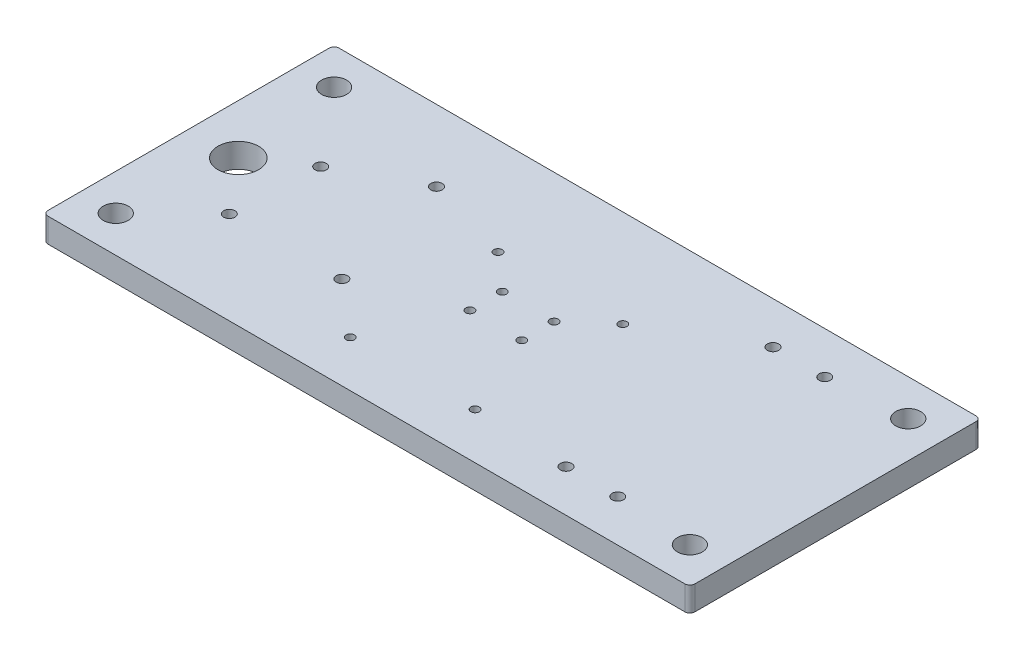
ISO-10303-21;
HEADER;
FILE_DESCRIPTION(('STEP AP214'),'2;1');
FILE_NAME('part.step','',(''),(''),'','','');
FILE_SCHEMA(('AUTOMOTIVE_DESIGN { 1 0 10303 214 1 1 1 1 }'));
ENDSEC;
DATA;
#1=APPLICATION_CONTEXT('core data for automotive mechanical design processes');
#2=APPLICATION_PROTOCOL_DEFINITION('international standard','automotive_design',2000,#1);
#3=PRODUCT_CONTEXT('',#1,'mechanical');
#4=PRODUCT('Part','Part','',(#3));
#5=PRODUCT_RELATED_PRODUCT_CATEGORY('part','',(#4));
#6=PRODUCT_DEFINITION_FORMATION('','',#4);
#7=PRODUCT_DEFINITION_CONTEXT('part definition',#1,'design');
#8=PRODUCT_DEFINITION('design','',#6,#7);
#9=PRODUCT_DEFINITION_SHAPE('','',#8);
#10=(LENGTH_UNIT() NAMED_UNIT(*) SI_UNIT(.MILLI.,.METRE.));
#11=(NAMED_UNIT(*) PLANE_ANGLE_UNIT() SI_UNIT($,.RADIAN.));
#12=(NAMED_UNIT(*) SI_UNIT($,.STERADIAN.) SOLID_ANGLE_UNIT());
#13=UNCERTAINTY_MEASURE_WITH_UNIT(LENGTH_MEASURE(1.E-05),#10,'distance_accuracy_value','');
#14=(GEOMETRIC_REPRESENTATION_CONTEXT(3) GLOBAL_UNCERTAINTY_ASSIGNED_CONTEXT((#13)) GLOBAL_UNIT_ASSIGNED_CONTEXT((#10,
#11,#12)) REPRESENTATION_CONTEXT('',''));
#15=CARTESIAN_POINT('',(0.,0.,0.));
#16=DIRECTION('',(0.,0.,1.));
#17=DIRECTION('',(1.,0.,0.));
#18=AXIS2_PLACEMENT_3D('',#15,#16,#17);
#19=CARTESIAN_POINT('',(127.,9.525,57.15));
#20=DIRECTION('',(-1.,0.,0.));
#21=DIRECTION('',(0.,0.,1.));
#22=AXIS2_PLACEMENT_3D('',#19,#20,#21);
#23=PLANE('',#22);
#24=DIRECTION('',(0.,0.,-1.));
#25=VECTOR('',#24,1.);
#26=CARTESIAN_POINT('',(127.,0.,57.15));
#27=LINE('',#26,#25);
#28=CARTESIAN_POINT('',(127.,0.,55.15));
#29=VERTEX_POINT('',#28);
#30=CARTESIAN_POINT('',(127.,0.,-55.15));
#31=VERTEX_POINT('',#30);
#32=EDGE_CURVE('E139',#29,#31,#27,.T.);
#33=ORIENTED_EDGE('',*,*,#32,.T.);
#34=DIRECTION('',(0.,-1.,0.));
#35=VECTOR('',#34,1.);
#36=CARTESIAN_POINT('',(127.,9.525,-55.15));
#37=LINE('',#36,#35);
#38=CARTESIAN_POINT('',(127.,9.525,-55.15));
#39=VERTEX_POINT('',#38);
#40=EDGE_CURVE('E173',#31,#39,#37,.F.);
#41=ORIENTED_EDGE('',*,*,#40,.T.);
#42=DIRECTION('',(0.,0.,-1.));
#43=VECTOR('',#42,1.);
#44=CARTESIAN_POINT('',(127.,9.525,57.15));
#45=LINE('',#44,#43);
#46=CARTESIAN_POINT('',(127.,9.525,55.15));
#47=VERTEX_POINT('',#46);
#48=EDGE_CURVE('E137',#47,#39,#45,.T.);
#49=ORIENTED_EDGE('',*,*,#48,.F.);
#50=DIRECTION('',(0.,-1.,0.));
#51=VECTOR('',#50,1.);
#52=CARTESIAN_POINT('',(127.,9.525,55.15));
#53=LINE('',#52,#51);
#54=EDGE_CURVE('E167',#47,#29,#53,.T.);
#55=ORIENTED_EDGE('',*,*,#54,.T.);
#56=EDGE_LOOP('',(#33,#41,#49,#55));
#57=FACE_BOUND('',#56,.T.);
#58=ADVANCED_FACE('F41',(#57),#23,.F.);
#59=CARTESIAN_POINT('',(-127.,9.525,-57.15));
#60=DIRECTION('',(0.,0.,1.));
#61=DIRECTION('',(1.,0.,0.));
#62=AXIS2_PLACEMENT_3D('',#59,#60,#61);
#63=PLANE('',#62);
#64=DIRECTION('',(-1.,0.,0.));
#65=VECTOR('',#64,1.);
#66=CARTESIAN_POINT('',(-127.,0.,-57.15));
#67=LINE('',#66,#65);
#68=CARTESIAN_POINT('',(125.,0.,-57.15));
#69=VERTEX_POINT('',#68);
#70=CARTESIAN_POINT('',(-125.,0.,-57.15));
#71=VERTEX_POINT('',#70);
#72=EDGE_CURVE('E131',#69,#71,#67,.T.);
#73=ORIENTED_EDGE('',*,*,#72,.T.);
#74=DIRECTION('',(0.,-1.,0.));
#75=VECTOR('',#74,1.);
#76=CARTESIAN_POINT('',(-125.,9.525,-57.15));
#77=LINE('',#76,#75);
#78=CARTESIAN_POINT('',(-125.,9.525,-57.15));
#79=VERTEX_POINT('',#78);
#80=EDGE_CURVE('E111',#71,#79,#77,.F.);
#81=ORIENTED_EDGE('',*,*,#80,.T.);
#82=DIRECTION('',(-1.,0.,0.));
#83=VECTOR('',#82,1.);
#84=CARTESIAN_POINT('',(-127.,9.525,-57.15));
#85=LINE('',#84,#83);
#86=CARTESIAN_POINT('',(125.,9.525,-57.15));
#87=VERTEX_POINT('',#86);
#88=EDGE_CURVE('E292',#87,#79,#85,.T.);
#89=ORIENTED_EDGE('',*,*,#88,.F.);
#90=DIRECTION('',(0.,-1.,0.));
#91=VECTOR('',#90,1.);
#92=CARTESIAN_POINT('',(125.,9.525,-57.15));
#93=LINE('',#92,#91);
#94=EDGE_CURVE('E118',#87,#69,#93,.T.);
#95=ORIENTED_EDGE('',*,*,#94,.T.);
#96=EDGE_LOOP('',(#73,#81,#89,#95));
#97=FACE_BOUND('',#96,.T.);
#98=ADVANCED_FACE('F308',(#97),#63,.F.);
#99=CARTESIAN_POINT('',(-127.,9.525,57.15));
#100=DIRECTION('',(1.,0.,0.));
#101=DIRECTION('',(0.,0.,-1.));
#102=AXIS2_PLACEMENT_3D('',#99,#100,#101);
#103=PLANE('',#102);
#104=DIRECTION('',(0.,0.,1.));
#105=VECTOR('',#104,1.);
#106=CARTESIAN_POINT('',(-127.,9.525,57.15));
#107=LINE('',#106,#105);
#108=CARTESIAN_POINT('',(-127.,9.525,-55.15));
#109=VERTEX_POINT('',#108);
#110=CARTESIAN_POINT('',(-127.,9.525,55.15));
#111=VERTEX_POINT('',#110);
#112=EDGE_CURVE('E130',#109,#111,#107,.T.);
#113=ORIENTED_EDGE('',*,*,#112,.F.);
#114=DIRECTION('',(0.,-1.,0.));
#115=VECTOR('',#114,1.);
#116=CARTESIAN_POINT('',(-127.,9.525,-55.15));
#117=LINE('',#116,#115);
#118=CARTESIAN_POINT('',(-127.,0.,-55.15));
#119=VERTEX_POINT('',#118);
#120=EDGE_CURVE('E115',#109,#119,#117,.T.);
#121=ORIENTED_EDGE('',*,*,#120,.T.);
#122=DIRECTION('',(0.,0.,1.));
#123=VECTOR('',#122,1.);
#124=CARTESIAN_POINT('',(-127.,0.,57.15));
#125=LINE('',#124,#123);
#126=CARTESIAN_POINT('',(-127.,0.,55.15));
#127=VERTEX_POINT('',#126);
#128=EDGE_CURVE('E124',#119,#127,#125,.T.);
#129=ORIENTED_EDGE('',*,*,#128,.T.);
#130=DIRECTION('',(0.,-1.,0.));
#131=VECTOR('',#130,1.);
#132=CARTESIAN_POINT('',(-127.,9.525,55.15));
#133=LINE('',#132,#131);
#134=EDGE_CURVE('E128',#127,#111,#133,.F.);
#135=ORIENTED_EDGE('',*,*,#134,.T.);
#136=EDGE_LOOP('',(#113,#121,#129,#135));
#137=FACE_BOUND('',#136,.T.);
#138=ADVANCED_FACE('F122',(#137),#103,.F.);
#139=CARTESIAN_POINT('',(-127.,9.525,57.15));
#140=DIRECTION('',(0.,0.,-1.));
#141=DIRECTION('',(-1.,0.,0.));
#142=AXIS2_PLACEMENT_3D('',#139,#140,#141);
#143=PLANE('',#142);
#144=DIRECTION('',(1.,0.,0.));
#145=VECTOR('',#144,1.);
#146=CARTESIAN_POINT('',(-127.,0.,57.15));
#147=LINE('',#146,#145);
#148=CARTESIAN_POINT('',(-125.,0.,57.15));
#149=VERTEX_POINT('',#148);
#150=CARTESIAN_POINT('',(125.,0.,57.15));
#151=VERTEX_POINT('',#150);
#152=EDGE_CURVE('E134',#149,#151,#147,.T.);
#153=ORIENTED_EDGE('',*,*,#152,.T.);
#154=DIRECTION('',(0.,-1.,0.));
#155=VECTOR('',#154,1.);
#156=CARTESIAN_POINT('',(125.,9.525,57.15));
#157=LINE('',#156,#155);
#158=CARTESIAN_POINT('',(125.,9.525,57.15));
#159=VERTEX_POINT('',#158);
#160=EDGE_CURVE('E11',#151,#159,#157,.F.);
#161=ORIENTED_EDGE('',*,*,#160,.T.);
#162=DIRECTION('',(1.,0.,0.));
#163=VECTOR('',#162,1.);
#164=CARTESIAN_POINT('',(-127.,9.525,57.15));
#165=LINE('',#164,#163);
#166=CARTESIAN_POINT('',(-125.,9.525,57.15));
#167=VERTEX_POINT('',#166);
#168=EDGE_CURVE('E155',#167,#159,#165,.T.);
#169=ORIENTED_EDGE('',*,*,#168,.F.);
#170=DIRECTION('',(0.,-1.,0.));
#171=VECTOR('',#170,1.);
#172=CARTESIAN_POINT('',(-125.,9.525,57.15));
#173=LINE('',#172,#171);
#174=EDGE_CURVE('E49',#167,#149,#173,.T.);
#175=ORIENTED_EDGE('',*,*,#174,.T.);
#176=EDGE_LOOP('',(#153,#161,#169,#175));
#177=FACE_BOUND('',#176,.T.);
#178=ADVANCED_FACE('F320',(#177),#143,.F.);
#179=CARTESIAN_POINT('',(0.,9.525,0.));
#180=DIRECTION('',(0.,-1.,0.));
#181=DIRECTION('',(0.,0.,-1.));
#182=AXIS2_PLACEMENT_3D('',#179,#180,#181);
#183=PLANE('',#182);
#184=CARTESIAN_POINT('',(-10.16,9.525,6.35));
#185=DIRECTION('',(0.,1.,0.));
#186=DIRECTION('',(0.,0.,1.));
#187=AXIS2_PLACEMENT_3D('',#184,#185,#186);
#188=CIRCLE('',#187,1.65);
#189=CARTESIAN_POINT('',(-10.16,9.525,8.));
#190=VERTEX_POINT('',#189);
#191=EDGE_CURVE('E223',#190,#190,#188,.T.);
#192=ORIENTED_EDGE('',*,*,#191,.F.);
#193=EDGE_LOOP('',(#192));
#194=FACE_BOUND('',#193,.T.);
#195=CARTESIAN_POINT('',(10.16,9.525,6.35));
#196=DIRECTION('',(0.,1.,0.));
#197=DIRECTION('',(0.,0.,1.));
#198=AXIS2_PLACEMENT_3D('',#195,#196,#197);
#199=CIRCLE('',#198,1.65);
#200=CARTESIAN_POINT('',(10.16,9.525,8.));
#201=VERTEX_POINT('',#200);
#202=EDGE_CURVE('E212',#201,#201,#199,.T.);
#203=ORIENTED_EDGE('',*,*,#202,.F.);
#204=EDGE_LOOP('',(#203));
#205=FACE_BOUND('',#204,.T.);
#206=CARTESIAN_POINT('',(10.16,9.525,-6.35));
#207=DIRECTION('',(0.,1.,0.));
#208=DIRECTION('',(0.,0.,1.));
#209=AXIS2_PLACEMENT_3D('',#206,#207,#208);
#210=CIRCLE('',#209,1.65);
#211=CARTESIAN_POINT('',(10.16,9.525,-4.7));
#212=VERTEX_POINT('',#211);
#213=EDGE_CURVE('E209',#212,#212,#210,.T.);
#214=ORIENTED_EDGE('',*,*,#213,.F.);
#215=EDGE_LOOP('',(#214));
#216=FACE_BOUND('',#215,.T.);
#217=CARTESIAN_POINT('',(-10.16,9.525,-6.35));
#218=DIRECTION('',(0.,1.,0.));
#219=DIRECTION('',(0.,0.,1.));
#220=AXIS2_PLACEMENT_3D('',#217,#218,#219);
#221=CIRCLE('',#220,1.65);
#222=CARTESIAN_POINT('',(-10.16,9.525,-4.7));
#223=VERTEX_POINT('',#222);
#224=EDGE_CURVE('E204',#223,#223,#221,.T.);
#225=ORIENTED_EDGE('',*,*,#224,.F.);
#226=EDGE_LOOP('',(#225));
#227=FACE_BOUND('',#226,.T.);
#228=CARTESIAN_POINT('',(61.84,9.525,40.64));
#229=DIRECTION('',(0.,1.,0.));
#230=DIRECTION('',(0.,0.,1.));
#231=AXIS2_PLACEMENT_3D('',#228,#229,#230);
#232=CIRCLE('',#231,2.225);
#233=CARTESIAN_POINT('',(61.84,9.525,42.865));
#234=VERTEX_POINT('',#233);
#235=EDGE_CURVE('E201',#234,#234,#232,.T.);
#236=ORIENTED_EDGE('',*,*,#235,.F.);
#237=EDGE_LOOP('',(#236));
#238=FACE_BOUND('',#237,.T.);
#239=CARTESIAN_POINT('',(82.16,9.525,40.64));
#240=DIRECTION('',(0.,1.,0.));
#241=DIRECTION('',(0.,0.,1.));
#242=AXIS2_PLACEMENT_3D('',#239,#240,#241);
#243=CIRCLE('',#242,2.225);
#244=CARTESIAN_POINT('',(82.16,9.525,42.865));
#245=VERTEX_POINT('',#244);
#246=EDGE_CURVE('E200',#245,#245,#243,.T.);
#247=ORIENTED_EDGE('',*,*,#246,.F.);
#248=EDGE_LOOP('',(#247));
#249=FACE_BOUND('',#248,.T.);
#250=CARTESIAN_POINT('',(82.16,9.525,-40.64));
#251=DIRECTION('',(0.,1.,0.));
#252=DIRECTION('',(0.,0.,1.));
#253=AXIS2_PLACEMENT_3D('',#250,#251,#252);
#254=CIRCLE('',#253,2.225);
#255=CARTESIAN_POINT('',(82.16,9.525,-38.415));
#256=VERTEX_POINT('',#255);
#257=EDGE_CURVE('E193',#256,#256,#254,.T.);
#258=ORIENTED_EDGE('',*,*,#257,.F.);
#259=EDGE_LOOP('',(#258));
#260=FACE_BOUND('',#259,.T.);
#261=CARTESIAN_POINT('',(61.84,9.525,-40.64));
#262=DIRECTION('',(0.,1.,0.));
#263=DIRECTION('',(0.,0.,1.));
#264=AXIS2_PLACEMENT_3D('',#261,#262,#263);
#265=CIRCLE('',#264,2.225);
#266=CARTESIAN_POINT('',(61.84,9.525,-38.415));
#267=VERTEX_POINT('',#266);
#268=EDGE_CURVE('E189',#267,#267,#265,.T.);
#269=ORIENTED_EDGE('',*,*,#268,.F.);
#270=EDGE_LOOP('',(#269));
#271=FACE_BOUND('',#270,.T.);
#272=CARTESIAN_POINT('',(-107.475,9.525,0.));
#273=DIRECTION('',(0.,1.,0.));
#274=DIRECTION('',(0.,0.,1.));
#275=AXIS2_PLACEMENT_3D('',#272,#273,#274);
#276=CIRCLE('',#275,8.);
#277=CARTESIAN_POINT('',(-107.475,9.525,8.));
#278=VERTEX_POINT('',#277);
#279=EDGE_CURVE('E186',#278,#278,#276,.T.);
#280=ORIENTED_EDGE('',*,*,#279,.F.);
#281=EDGE_LOOP('',(#280));
#282=FACE_BOUND('',#281,.T.);
#283=CARTESIAN_POINT('',(-46.,9.525,20.8));
#284=DIRECTION('',(0.,1.,0.));
#285=DIRECTION('',(0.,0.,1.));
#286=AXIS2_PLACEMENT_3D('',#283,#284,#285);
#287=CIRCLE('',#286,2.225);
#288=CARTESIAN_POINT('',(-46.,9.525,23.025));
#289=VERTEX_POINT('',#288);
#290=EDGE_CURVE('E185',#289,#289,#287,.T.);
#291=ORIENTED_EDGE('',*,*,#290,.F.);
#292=EDGE_LOOP('',(#291));
#293=FACE_BOUND('',#292,.T.);
#294=CARTESIAN_POINT('',(-90.2,9.525,20.8));
#295=DIRECTION('',(0.,1.,0.));
#296=DIRECTION('',(0.,0.,1.));
#297=AXIS2_PLACEMENT_3D('',#294,#295,#296);
#298=CIRCLE('',#297,2.225);
#299=CARTESIAN_POINT('',(-90.2,9.525,23.025));
#300=VERTEX_POINT('',#299);
#301=EDGE_CURVE('E181',#300,#300,#298,.T.);
#302=ORIENTED_EDGE('',*,*,#301,.F.);
#303=EDGE_LOOP('',(#302));
#304=FACE_BOUND('',#303,.T.);
#305=CARTESIAN_POINT('',(-88.35,9.525,-13.25));
#306=DIRECTION('',(0.,1.,0.));
#307=DIRECTION('',(0.,0.,1.));
#308=AXIS2_PLACEMENT_3D('',#305,#306,#307);
#309=CIRCLE('',#308,2.225);
#310=CARTESIAN_POINT('',(-88.35,9.525,-11.025));
#311=VERTEX_POINT('',#310);
#312=EDGE_CURVE('E179',#311,#311,#309,.T.);
#313=ORIENTED_EDGE('',*,*,#312,.F.);
#314=EDGE_LOOP('',(#313));
#315=FACE_BOUND('',#314,.T.);
#316=CARTESIAN_POINT('',(-58.8,9.525,-29.15));
#317=DIRECTION('',(0.,1.,0.));
#318=DIRECTION('',(0.,0.,1.));
#319=AXIS2_PLACEMENT_3D('',#316,#317,#318);
#320=CIRCLE('',#319,2.225);
#321=CARTESIAN_POINT('',(-58.8,9.525,-26.925));
#322=VERTEX_POINT('',#321);
#323=EDGE_CURVE('E178',#322,#322,#320,.T.);
#324=ORIENTED_EDGE('',*,*,#323,.F.);
#325=EDGE_LOOP('',(#324));
#326=FACE_BOUND('',#325,.T.);
#327=CARTESIAN_POINT('',(-24.5,9.525,39.));
#328=DIRECTION('',(0.,1.,0.));
#329=DIRECTION('',(0.,0.,1.));
#330=AXIS2_PLACEMENT_3D('',#327,#328,#329);
#331=CIRCLE('',#330,1.65);
#332=CARTESIAN_POINT('',(-24.5,9.525,40.65));
#333=VERTEX_POINT('',#332);
#334=EDGE_CURVE('E253',#333,#333,#331,.T.);
#335=ORIENTED_EDGE('',*,*,#334,.F.);
#336=EDGE_LOOP('',(#335));
#337=FACE_BOUND('',#336,.T.);
#338=CARTESIAN_POINT('',(24.5,9.525,39.));
#339=DIRECTION('',(0.,1.,0.));
#340=DIRECTION('',(0.,0.,1.));
#341=AXIS2_PLACEMENT_3D('',#338,#339,#340);
#342=CIRCLE('',#341,1.65);
#343=CARTESIAN_POINT('',(24.5,9.525,40.65));
#344=VERTEX_POINT('',#343);
#345=EDGE_CURVE('E260',#344,#344,#342,.T.);
#346=ORIENTED_EDGE('',*,*,#345,.F.);
#347=EDGE_LOOP('',(#346));
#348=FACE_BOUND('',#347,.T.);
#349=CARTESIAN_POINT('',(-24.5,9.525,-19.));
#350=DIRECTION('',(0.,1.,0.));
#351=DIRECTION('',(0.,0.,1.));
#352=AXIS2_PLACEMENT_3D('',#349,#350,#351);
#353=CIRCLE('',#352,1.65);
#354=CARTESIAN_POINT('',(-24.5,9.525,-17.35));
#355=VERTEX_POINT('',#354);
#356=EDGE_CURVE('E152',#355,#355,#353,.T.);
#357=ORIENTED_EDGE('',*,*,#356,.F.);
#358=EDGE_LOOP('',(#357));
#359=FACE_BOUND('',#358,.T.);
#360=CARTESIAN_POINT('',(24.5,9.525,-19.));
#361=DIRECTION('',(0.,1.,0.));
#362=DIRECTION('',(0.,0.,1.));
#363=AXIS2_PLACEMENT_3D('',#360,#361,#362);
#364=CIRCLE('',#363,1.65);
#365=CARTESIAN_POINT('',(24.5,9.525,-17.35));
#366=VERTEX_POINT('',#365);
#367=EDGE_CURVE('E147',#366,#366,#364,.T.);
#368=ORIENTED_EDGE('',*,*,#367,.F.);
#369=EDGE_LOOP('',(#368));
#370=FACE_BOUND('',#369,.T.);
#371=CARTESIAN_POINT('',(112.7125,9.525,-42.8625000000012));
#372=DIRECTION('',(0.,1.,0.));
#373=DIRECTION('',(0.,0.,1.));
#374=AXIS2_PLACEMENT_3D('',#371,#372,#373);
#375=CIRCLE('',#374,4.9022);
#376=CARTESIAN_POINT('',(112.7125,9.525,-37.9603000000012));
#377=VERTEX_POINT('',#376);
#378=EDGE_CURVE('E275',#377,#377,#375,.T.);
#379=ORIENTED_EDGE('',*,*,#378,.F.);
#380=EDGE_LOOP('',(#379));
#381=FACE_BOUND('',#380,.T.);
#382=CARTESIAN_POINT('',(112.7125,9.525,42.8674999999988));
#383=DIRECTION('',(0.,1.,0.));
#384=DIRECTION('',(0.,0.,1.));
#385=AXIS2_PLACEMENT_3D('',#382,#383,#384);
#386=CIRCLE('',#385,4.9022);
#387=CARTESIAN_POINT('',(112.7125,9.525,47.7696999999988));
#388=VERTEX_POINT('',#387);
#389=EDGE_CURVE('E148',#388,#388,#386,.T.);
#390=ORIENTED_EDGE('',*,*,#389,.F.);
#391=EDGE_LOOP('',(#390));
#392=FACE_BOUND('',#391,.T.);
#393=CARTESIAN_POINT('',(-112.7175,9.525,-42.8625000000012));
#394=DIRECTION('',(0.,1.,0.));
#395=DIRECTION('',(0.,0.,1.));
#396=AXIS2_PLACEMENT_3D('',#393,#394,#395);
#397=CIRCLE('',#396,4.9022);
#398=CARTESIAN_POINT('',(-112.7175,9.525,-37.9603000000012));
#399=VERTEX_POINT('',#398);
#400=EDGE_CURVE('E144',#399,#399,#397,.T.);
#401=ORIENTED_EDGE('',*,*,#400,.F.);
#402=EDGE_LOOP('',(#401));
#403=FACE_BOUND('',#402,.T.);
#404=CARTESIAN_POINT('',(-112.7175,9.525,42.867499999999));
#405=DIRECTION('',(0.,1.,0.));
#406=DIRECTION('',(0.,0.,1.));
#407=AXIS2_PLACEMENT_3D('',#404,#405,#406);
#408=CIRCLE('',#407,4.9022);
#409=CARTESIAN_POINT('',(-112.7175,9.525,47.769699999999));
#410=VERTEX_POINT('',#409);
#411=EDGE_CURVE('E283',#410,#410,#408,.T.);
#412=ORIENTED_EDGE('',*,*,#411,.F.);
#413=EDGE_LOOP('',(#412));
#414=FACE_BOUND('',#413,.T.);
#415=ORIENTED_EDGE('',*,*,#88,.T.);
#416=CARTESIAN_POINT('',(-125.,9.525,-55.15));
#417=DIRECTION('',(0.,-1.,0.));
#418=DIRECTION('',(0.,0.,-1.));
#419=AXIS2_PLACEMENT_3D('',#416,#417,#418);
#420=CIRCLE('',#419,2.);
#421=EDGE_CURVE('E166',#79,#109,#420,.F.);
#422=ORIENTED_EDGE('',*,*,#421,.T.);
#423=ORIENTED_EDGE('',*,*,#112,.T.);
#424=CARTESIAN_POINT('',(-125.,9.525,55.15));
#425=DIRECTION('',(0.,-1.,0.));
#426=DIRECTION('',(0.,0.,-1.));
#427=AXIS2_PLACEMENT_3D('',#424,#425,#426);
#428=CIRCLE('',#427,2.);
#429=EDGE_CURVE('E64',#111,#167,#428,.F.);
#430=ORIENTED_EDGE('',*,*,#429,.T.);
#431=ORIENTED_EDGE('',*,*,#168,.T.);
#432=CARTESIAN_POINT('',(125.,9.525,55.15));
#433=DIRECTION('',(0.,-1.,0.));
#434=DIRECTION('',(0.,0.,-1.));
#435=AXIS2_PLACEMENT_3D('',#432,#433,#434);
#436=CIRCLE('',#435,2.);
#437=EDGE_CURVE('E165',#159,#47,#436,.F.);
#438=ORIENTED_EDGE('',*,*,#437,.T.);
#439=ORIENTED_EDGE('',*,*,#48,.T.);
#440=CARTESIAN_POINT('',(125.,9.525,-55.15));
#441=DIRECTION('',(0.,-1.,0.));
#442=DIRECTION('',(0.,0.,-1.));
#443=AXIS2_PLACEMENT_3D('',#440,#441,#442);
#444=CIRCLE('',#443,2.);
#445=EDGE_CURVE('E161',#39,#87,#444,.F.);
#446=ORIENTED_EDGE('',*,*,#445,.T.);
#447=EDGE_LOOP('',(#415,#422,#423,#430,#431,#438,#439,#446));
#448=FACE_BOUND('',#447,.T.);
#449=ADVANCED_FACE('F306',(#194,#205,#216,#227,#238,#249,#260,#271,#282,#293,#304,#315,#326,
#337,#348,#359,#370,#381,#392,#403,#414,#448),#183,.F.);
#450=CARTESIAN_POINT('',(0.,0.,0.));
#451=DIRECTION('',(0.,-1.,0.));
#452=DIRECTION('',(0.,0.,-1.));
#453=AXIS2_PLACEMENT_3D('',#450,#451,#452);
#454=PLANE('',#453);
#455=CARTESIAN_POINT('',(-10.16,0.,6.35));
#456=DIRECTION('',(0.,-1.,0.));
#457=DIRECTION('',(0.,0.,-1.));
#458=AXIS2_PLACEMENT_3D('',#455,#456,#457);
#459=CIRCLE('',#458,1.65);
#460=CARTESIAN_POINT('',(-10.16,0.,4.7));
#461=VERTEX_POINT('',#460);
#462=EDGE_CURVE('E44',#461,#461,#459,.T.);
#463=ORIENTED_EDGE('',*,*,#462,.F.);
#464=EDGE_LOOP('',(#463));
#465=FACE_BOUND('',#464,.T.);
#466=CARTESIAN_POINT('',(10.16,0.,6.35));
#467=DIRECTION('',(0.,-1.,0.));
#468=DIRECTION('',(0.,0.,-1.));
#469=AXIS2_PLACEMENT_3D('',#466,#467,#468);
#470=CIRCLE('',#469,1.65);
#471=CARTESIAN_POINT('',(10.16,0.,4.7));
#472=VERTEX_POINT('',#471);
#473=EDGE_CURVE('E206',#472,#472,#470,.T.);
#474=ORIENTED_EDGE('',*,*,#473,.F.);
#475=EDGE_LOOP('',(#474));
#476=FACE_BOUND('',#475,.T.);
#477=CARTESIAN_POINT('',(10.16,0.,-6.35));
#478=DIRECTION('',(0.,-1.,0.));
#479=DIRECTION('',(0.,0.,-1.));
#480=AXIS2_PLACEMENT_3D('',#477,#478,#479);
#481=CIRCLE('',#480,1.65);
#482=CARTESIAN_POINT('',(10.16,0.,-8.));
#483=VERTEX_POINT('',#482);
#484=EDGE_CURVE('E207',#483,#483,#481,.T.);
#485=ORIENTED_EDGE('',*,*,#484,.F.);
#486=EDGE_LOOP('',(#485));
#487=FACE_BOUND('',#486,.T.);
#488=CARTESIAN_POINT('',(-10.16,0.,-6.35));
#489=DIRECTION('',(0.,-1.,0.));
#490=DIRECTION('',(0.,0.,-1.));
#491=AXIS2_PLACEMENT_3D('',#488,#489,#490);
#492=CIRCLE('',#491,1.65);
#493=CARTESIAN_POINT('',(-10.16,0.,-8.));
#494=VERTEX_POINT('',#493);
#495=EDGE_CURVE('E205',#494,#494,#492,.T.);
#496=ORIENTED_EDGE('',*,*,#495,.F.);
#497=EDGE_LOOP('',(#496));
#498=FACE_BOUND('',#497,.T.);
#499=CARTESIAN_POINT('',(61.84,0.,40.64));
#500=DIRECTION('',(0.,-1.,0.));
#501=DIRECTION('',(0.,0.,-1.));
#502=AXIS2_PLACEMENT_3D('',#499,#500,#501);
#503=CIRCLE('',#502,2.225);
#504=CARTESIAN_POINT('',(61.84,0.,38.415));
#505=VERTEX_POINT('',#504);
#506=EDGE_CURVE('E198',#505,#505,#503,.T.);
#507=ORIENTED_EDGE('',*,*,#506,.F.);
#508=EDGE_LOOP('',(#507));
#509=FACE_BOUND('',#508,.T.);
#510=CARTESIAN_POINT('',(82.16,0.,40.64));
#511=DIRECTION('',(0.,-1.,0.));
#512=DIRECTION('',(0.,0.,-1.));
#513=AXIS2_PLACEMENT_3D('',#510,#511,#512);
#514=CIRCLE('',#513,2.225);
#515=CARTESIAN_POINT('',(82.16,0.,38.415));
#516=VERTEX_POINT('',#515);
#517=EDGE_CURVE('E192',#516,#516,#514,.T.);
#518=ORIENTED_EDGE('',*,*,#517,.F.);
#519=EDGE_LOOP('',(#518));
#520=FACE_BOUND('',#519,.T.);
#521=CARTESIAN_POINT('',(82.16,0.,-40.64));
#522=DIRECTION('',(0.,-1.,0.));
#523=DIRECTION('',(0.,0.,-1.));
#524=AXIS2_PLACEMENT_3D('',#521,#522,#523);
#525=CIRCLE('',#524,2.225);
#526=CARTESIAN_POINT('',(82.16,0.,-42.865));
#527=VERTEX_POINT('',#526);
#528=EDGE_CURVE('E187',#527,#527,#525,.T.);
#529=ORIENTED_EDGE('',*,*,#528,.F.);
#530=EDGE_LOOP('',(#529));
#531=FACE_BOUND('',#530,.T.);
#532=CARTESIAN_POINT('',(61.84,0.,-40.64));
#533=DIRECTION('',(0.,-1.,0.));
#534=DIRECTION('',(0.,0.,-1.));
#535=AXIS2_PLACEMENT_3D('',#532,#533,#534);
#536=CIRCLE('',#535,2.225);
#537=CARTESIAN_POINT('',(61.84,0.,-42.865));
#538=VERTEX_POINT('',#537);
#539=EDGE_CURVE('E184',#538,#538,#536,.T.);
#540=ORIENTED_EDGE('',*,*,#539,.F.);
#541=EDGE_LOOP('',(#540));
#542=FACE_BOUND('',#541,.T.);
#543=CARTESIAN_POINT('',(-107.475,0.,0.));
#544=DIRECTION('',(0.,1.,0.));
#545=DIRECTION('',(0.,0.,1.));
#546=AXIS2_PLACEMENT_3D('',#543,#544,#545);
#547=CIRCLE('',#546,8.);
#548=CARTESIAN_POINT('',(-107.475,0.,8.));
#549=VERTEX_POINT('',#548);
#550=EDGE_CURVE('E234',#549,#549,#547,.T.);
#551=ORIENTED_EDGE('',*,*,#550,.T.);
#552=EDGE_LOOP('',(#551));
#553=FACE_BOUND('',#552,.T.);
#554=CARTESIAN_POINT('',(-46.,0.,20.8));
#555=DIRECTION('',(0.,-1.,0.));
#556=DIRECTION('',(0.,0.,-1.));
#557=AXIS2_PLACEMENT_3D('',#554,#555,#556);
#558=CIRCLE('',#557,2.225);
#559=CARTESIAN_POINT('',(-46.,0.,18.575));
#560=VERTEX_POINT('',#559);
#561=EDGE_CURVE('E176',#560,#560,#558,.T.);
#562=ORIENTED_EDGE('',*,*,#561,.F.);
#563=EDGE_LOOP('',(#562));
#564=FACE_BOUND('',#563,.T.);
#565=CARTESIAN_POINT('',(-90.2,0.,20.8));
#566=DIRECTION('',(0.,-1.,0.));
#567=DIRECTION('',(0.,0.,-1.));
#568=AXIS2_PLACEMENT_3D('',#565,#566,#567);
#569=CIRCLE('',#568,2.225);
#570=CARTESIAN_POINT('',(-90.2,0.,18.575));
#571=VERTEX_POINT('',#570);
#572=EDGE_CURVE('E242',#571,#571,#569,.T.);
#573=ORIENTED_EDGE('',*,*,#572,.F.);
#574=EDGE_LOOP('',(#573));
#575=FACE_BOUND('',#574,.T.);
#576=CARTESIAN_POINT('',(-88.35,0.,-13.25));
#577=DIRECTION('',(0.,-1.,0.));
#578=DIRECTION('',(0.,0.,-1.));
#579=AXIS2_PLACEMENT_3D('',#576,#577,#578);
#580=CIRCLE('',#579,2.225);
#581=CARTESIAN_POINT('',(-88.35,0.,-15.475));
#582=VERTEX_POINT('',#581);
#583=EDGE_CURVE('E172',#582,#582,#580,.T.);
#584=ORIENTED_EDGE('',*,*,#583,.F.);
#585=EDGE_LOOP('',(#584));
#586=FACE_BOUND('',#585,.T.);
#587=CARTESIAN_POINT('',(-58.8,0.,-29.15));
#588=DIRECTION('',(0.,-1.,0.));
#589=DIRECTION('',(0.,0.,-1.));
#590=AXIS2_PLACEMENT_3D('',#587,#588,#589);
#591=CIRCLE('',#590,2.225);
#592=CARTESIAN_POINT('',(-58.8,0.,-31.375));
#593=VERTEX_POINT('',#592);
#594=EDGE_CURVE('E247',#593,#593,#591,.T.);
#595=ORIENTED_EDGE('',*,*,#594,.F.);
#596=EDGE_LOOP('',(#595));
#597=FACE_BOUND('',#596,.T.);
#598=CARTESIAN_POINT('',(-24.5,0.,39.));
#599=DIRECTION('',(0.,-1.,0.));
#600=DIRECTION('',(0.,0.,-1.));
#601=AXIS2_PLACEMENT_3D('',#598,#599,#600);
#602=CIRCLE('',#601,1.65);
#603=CARTESIAN_POINT('',(-24.5,0.,37.35));
#604=VERTEX_POINT('',#603);
#605=EDGE_CURVE('E258',#604,#604,#602,.T.);
#606=ORIENTED_EDGE('',*,*,#605,.F.);
#607=EDGE_LOOP('',(#606));
#608=FACE_BOUND('',#607,.T.);
#609=CARTESIAN_POINT('',(24.5,0.,39.));
#610=DIRECTION('',(0.,-1.,0.));
#611=DIRECTION('',(0.,0.,-1.));
#612=AXIS2_PLACEMENT_3D('',#609,#610,#611);
#613=CIRCLE('',#612,1.65);
#614=CARTESIAN_POINT('',(24.5,0.,37.35));
#615=VERTEX_POINT('',#614);
#616=EDGE_CURVE('E265',#615,#615,#613,.T.);
#617=ORIENTED_EDGE('',*,*,#616,.F.);
#618=EDGE_LOOP('',(#617));
#619=FACE_BOUND('',#618,.T.);
#620=CARTESIAN_POINT('',(-24.5,0.,-19.));
#621=DIRECTION('',(0.,-1.,0.));
#622=DIRECTION('',(0.,0.,-1.));
#623=AXIS2_PLACEMENT_3D('',#620,#621,#622);
#624=CIRCLE('',#623,1.65);
#625=CARTESIAN_POINT('',(-24.5,0.,-20.65));
#626=VERTEX_POINT('',#625);
#627=EDGE_CURVE('E150',#626,#626,#624,.T.);
#628=ORIENTED_EDGE('',*,*,#627,.F.);
#629=EDGE_LOOP('',(#628));
#630=FACE_BOUND('',#629,.T.);
#631=CARTESIAN_POINT('',(24.5,0.,-19.));
#632=DIRECTION('',(0.,-1.,0.));
#633=DIRECTION('',(0.,0.,-1.));
#634=AXIS2_PLACEMENT_3D('',#631,#632,#633);
#635=CIRCLE('',#634,1.65);
#636=CARTESIAN_POINT('',(24.5,0.,-20.65));
#637=VERTEX_POINT('',#636);
#638=EDGE_CURVE('E267',#637,#637,#635,.T.);
#639=ORIENTED_EDGE('',*,*,#638,.F.);
#640=EDGE_LOOP('',(#639));
#641=FACE_BOUND('',#640,.T.);
#642=CARTESIAN_POINT('',(112.7125,0.,-42.8625000000012));
#643=DIRECTION('',(0.,-1.,0.));
#644=DIRECTION('',(0.,0.,-1.));
#645=AXIS2_PLACEMENT_3D('',#642,#643,#644);
#646=CIRCLE('',#645,4.9022);
#647=CARTESIAN_POINT('',(112.7125,0.,-47.7647000000012));
#648=VERTEX_POINT('',#647);
#649=EDGE_CURVE('E274',#648,#648,#646,.T.);
#650=ORIENTED_EDGE('',*,*,#649,.F.);
#651=EDGE_LOOP('',(#650));
#652=FACE_BOUND('',#651,.T.);
#653=CARTESIAN_POINT('',(112.7125,0.,42.8674999999988));
#654=DIRECTION('',(0.,-1.,0.));
#655=DIRECTION('',(0.,0.,-1.));
#656=AXIS2_PLACEMENT_3D('',#653,#654,#655);
#657=CIRCLE('',#656,4.9022);
#658=CARTESIAN_POINT('',(112.7125,0.,37.9652999999988));
#659=VERTEX_POINT('',#658);
#660=EDGE_CURVE('E145',#659,#659,#657,.T.);
#661=ORIENTED_EDGE('',*,*,#660,.F.);
#662=EDGE_LOOP('',(#661));
#663=FACE_BOUND('',#662,.T.);
#664=CARTESIAN_POINT('',(-112.7175,0.,-42.8625000000012));
#665=DIRECTION('',(0.,-1.,0.));
#666=DIRECTION('',(0.,0.,-1.));
#667=AXIS2_PLACEMENT_3D('',#664,#665,#666);
#668=CIRCLE('',#667,4.9022);
#669=CARTESIAN_POINT('',(-112.7175,0.,-47.7647000000012));
#670=VERTEX_POINT('',#669);
#671=EDGE_CURVE('E285',#670,#670,#668,.T.);
#672=ORIENTED_EDGE('',*,*,#671,.F.);
#673=EDGE_LOOP('',(#672));
#674=FACE_BOUND('',#673,.T.);
#675=CARTESIAN_POINT('',(-112.7175,0.,42.867499999999));
#676=DIRECTION('',(0.,-1.,0.));
#677=DIRECTION('',(0.,0.,-1.));
#678=AXIS2_PLACEMENT_3D('',#675,#676,#677);
#679=CIRCLE('',#678,4.9022);
#680=CARTESIAN_POINT('',(-112.7175,0.,37.965299999999));
#681=VERTEX_POINT('',#680);
#682=EDGE_CURVE('E289',#681,#681,#679,.T.);
#683=ORIENTED_EDGE('',*,*,#682,.F.);
#684=EDGE_LOOP('',(#683));
#685=FACE_BOUND('',#684,.T.);
#686=ORIENTED_EDGE('',*,*,#128,.F.);
#687=CARTESIAN_POINT('',(-125.,0.,-55.15));
#688=DIRECTION('',(0.,-1.,0.));
#689=DIRECTION('',(0.,0.,-1.));
#690=AXIS2_PLACEMENT_3D('',#687,#688,#689);
#691=CIRCLE('',#690,2.);
#692=EDGE_CURVE('E106',#119,#71,#691,.T.);
#693=ORIENTED_EDGE('',*,*,#692,.T.);
#694=ORIENTED_EDGE('',*,*,#72,.F.);
#695=CARTESIAN_POINT('',(125.,0.,-55.15));
#696=DIRECTION('',(0.,-1.,0.));
#697=DIRECTION('',(0.,0.,-1.));
#698=AXIS2_PLACEMENT_3D('',#695,#696,#697);
#699=CIRCLE('',#698,2.);
#700=EDGE_CURVE('E117',#69,#31,#699,.T.);
#701=ORIENTED_EDGE('',*,*,#700,.T.);
#702=ORIENTED_EDGE('',*,*,#32,.F.);
#703=CARTESIAN_POINT('',(125.,0.,55.15));
#704=DIRECTION('',(0.,-1.,0.));
#705=DIRECTION('',(0.,0.,-1.));
#706=AXIS2_PLACEMENT_3D('',#703,#704,#705);
#707=CIRCLE('',#706,2.);
#708=EDGE_CURVE('E151',#29,#151,#707,.T.);
#709=ORIENTED_EDGE('',*,*,#708,.T.);
#710=ORIENTED_EDGE('',*,*,#152,.F.);
#711=CARTESIAN_POINT('',(-125.,0.,55.15));
#712=DIRECTION('',(0.,-1.,0.));
#713=DIRECTION('',(0.,0.,-1.));
#714=AXIS2_PLACEMENT_3D('',#711,#712,#713);
#715=CIRCLE('',#714,2.);
#716=EDGE_CURVE('E127',#149,#127,#715,.T.);
#717=ORIENTED_EDGE('',*,*,#716,.T.);
#718=EDGE_LOOP('',(#686,#693,#694,#701,#702,#709,#710,#717));
#719=FACE_BOUND('',#718,.T.);
#720=ADVANCED_FACE('F132',(#465,#476,#487,#498,#509,#520,#531,#542,#553,#564,#575,#586,#597,
#608,#619,#630,#641,#652,#663,#674,#685,#719),#454,.T.);
#721=CARTESIAN_POINT('',(-112.7175,9.525,42.867499999999));
#722=DIRECTION('',(0.,1.,0.));
#723=DIRECTION('',(0.,0.,1.));
#724=AXIS2_PLACEMENT_3D('',#721,#722,#723);
#725=CYLINDRICAL_SURFACE('',#724,4.9022);
#726=ORIENTED_EDGE('',*,*,#682,.T.);
#727=EDGE_LOOP('',(#726));
#728=FACE_BOUND('',#727,.T.);
#729=ORIENTED_EDGE('',*,*,#411,.T.);
#730=EDGE_LOOP('',(#729));
#731=FACE_BOUND('',#730,.T.);
#732=ADVANCED_FACE('F342',(#728,#731),#725,.F.);
#733=CARTESIAN_POINT('',(-112.7175,9.525,-42.8625000000012));
#734=DIRECTION('',(0.,1.,0.));
#735=DIRECTION('',(0.,0.,1.));
#736=AXIS2_PLACEMENT_3D('',#733,#734,#735);
#737=CYLINDRICAL_SURFACE('',#736,4.9022);
#738=ORIENTED_EDGE('',*,*,#671,.T.);
#739=EDGE_LOOP('',(#738));
#740=FACE_BOUND('',#739,.T.);
#741=ORIENTED_EDGE('',*,*,#400,.T.);
#742=EDGE_LOOP('',(#741));
#743=FACE_BOUND('',#742,.T.);
#744=ADVANCED_FACE('F347',(#740,#743),#737,.F.);
#745=CARTESIAN_POINT('',(112.7125,9.525,42.8674999999988));
#746=DIRECTION('',(0.,1.,0.));
#747=DIRECTION('',(0.,0.,1.));
#748=AXIS2_PLACEMENT_3D('',#745,#746,#747);
#749=CYLINDRICAL_SURFACE('',#748,4.9022);
#750=ORIENTED_EDGE('',*,*,#660,.T.);
#751=EDGE_LOOP('',(#750));
#752=FACE_BOUND('',#751,.T.);
#753=ORIENTED_EDGE('',*,*,#389,.T.);
#754=EDGE_LOOP('',(#753));
#755=FACE_BOUND('',#754,.T.);
#756=ADVANCED_FACE('F352',(#752,#755),#749,.F.);
#757=CARTESIAN_POINT('',(112.7125,9.525,-42.8625000000012));
#758=DIRECTION('',(0.,1.,0.));
#759=DIRECTION('',(0.,0.,1.));
#760=AXIS2_PLACEMENT_3D('',#757,#758,#759);
#761=CYLINDRICAL_SURFACE('',#760,4.9022);
#762=ORIENTED_EDGE('',*,*,#649,.T.);
#763=EDGE_LOOP('',(#762));
#764=FACE_BOUND('',#763,.T.);
#765=ORIENTED_EDGE('',*,*,#378,.T.);
#766=EDGE_LOOP('',(#765));
#767=FACE_BOUND('',#766,.T.);
#768=ADVANCED_FACE('F360',(#764,#767),#761,.F.);
#769=CARTESIAN_POINT('',(24.5,9.525,-19.));
#770=DIRECTION('',(0.,1.,0.));
#771=DIRECTION('',(0.,0.,1.));
#772=AXIS2_PLACEMENT_3D('',#769,#770,#771);
#773=CYLINDRICAL_SURFACE('',#772,1.65);
#774=ORIENTED_EDGE('',*,*,#638,.T.);
#775=EDGE_LOOP('',(#774));
#776=FACE_BOUND('',#775,.T.);
#777=ORIENTED_EDGE('',*,*,#367,.T.);
#778=EDGE_LOOP('',(#777));
#779=FACE_BOUND('',#778,.T.);
#780=ADVANCED_FACE('F362',(#776,#779),#773,.F.);
#781=CARTESIAN_POINT('',(-24.5,9.525,-19.));
#782=DIRECTION('',(0.,1.,0.));
#783=DIRECTION('',(0.,0.,1.));
#784=AXIS2_PLACEMENT_3D('',#781,#782,#783);
#785=CYLINDRICAL_SURFACE('',#784,1.65);
#786=ORIENTED_EDGE('',*,*,#627,.T.);
#787=EDGE_LOOP('',(#786));
#788=FACE_BOUND('',#787,.T.);
#789=ORIENTED_EDGE('',*,*,#356,.T.);
#790=EDGE_LOOP('',(#789));
#791=FACE_BOUND('',#790,.T.);
#792=ADVANCED_FACE('F363',(#788,#791),#785,.F.);
#793=CARTESIAN_POINT('',(24.5,9.525,39.));
#794=DIRECTION('',(0.,1.,0.));
#795=DIRECTION('',(0.,0.,1.));
#796=AXIS2_PLACEMENT_3D('',#793,#794,#795);
#797=CYLINDRICAL_SURFACE('',#796,1.65);
#798=ORIENTED_EDGE('',*,*,#616,.T.);
#799=EDGE_LOOP('',(#798));
#800=FACE_BOUND('',#799,.T.);
#801=ORIENTED_EDGE('',*,*,#345,.T.);
#802=EDGE_LOOP('',(#801));
#803=FACE_BOUND('',#802,.T.);
#804=ADVANCED_FACE('F368',(#800,#803),#797,.F.);
#805=CARTESIAN_POINT('',(-24.5,9.525,39.));
#806=DIRECTION('',(0.,1.,0.));
#807=DIRECTION('',(0.,0.,1.));
#808=AXIS2_PLACEMENT_3D('',#805,#806,#807);
#809=CYLINDRICAL_SURFACE('',#808,1.65);
#810=ORIENTED_EDGE('',*,*,#605,.T.);
#811=EDGE_LOOP('',(#810));
#812=FACE_BOUND('',#811,.T.);
#813=ORIENTED_EDGE('',*,*,#334,.T.);
#814=EDGE_LOOP('',(#813));
#815=FACE_BOUND('',#814,.T.);
#816=ADVANCED_FACE('F324',(#812,#815),#809,.F.);
#817=CARTESIAN_POINT('',(-125.,9.525,-55.15));
#818=DIRECTION('',(0.,-1.,0.));
#819=DIRECTION('',(0.,0.,-1.));
#820=AXIS2_PLACEMENT_3D('',#817,#818,#819);
#821=CYLINDRICAL_SURFACE('',#820,2.);
#822=ORIENTED_EDGE('',*,*,#421,.F.);
#823=ORIENTED_EDGE('',*,*,#80,.F.);
#824=ORIENTED_EDGE('',*,*,#692,.F.);
#825=ORIENTED_EDGE('',*,*,#120,.F.);
#826=EDGE_LOOP('',(#822,#823,#824,#825));
#827=FACE_BOUND('',#826,.T.);
#828=ADVANCED_FACE('F113',(#827),#821,.T.);
#829=CARTESIAN_POINT('',(125.,9.525,-55.15));
#830=DIRECTION('',(0.,-1.,0.));
#831=DIRECTION('',(0.,0.,-1.));
#832=AXIS2_PLACEMENT_3D('',#829,#830,#831);
#833=CYLINDRICAL_SURFACE('',#832,2.);
#834=ORIENTED_EDGE('',*,*,#445,.F.);
#835=ORIENTED_EDGE('',*,*,#40,.F.);
#836=ORIENTED_EDGE('',*,*,#700,.F.);
#837=ORIENTED_EDGE('',*,*,#94,.F.);
#838=EDGE_LOOP('',(#834,#835,#836,#837));
#839=FACE_BOUND('',#838,.T.);
#840=ADVANCED_FACE('F301',(#839),#833,.T.);
#841=CARTESIAN_POINT('',(125.,9.525,55.15));
#842=DIRECTION('',(0.,-1.,0.));
#843=DIRECTION('',(0.,0.,-1.));
#844=AXIS2_PLACEMENT_3D('',#841,#842,#843);
#845=CYLINDRICAL_SURFACE('',#844,2.);
#846=ORIENTED_EDGE('',*,*,#437,.F.);
#847=ORIENTED_EDGE('',*,*,#160,.F.);
#848=ORIENTED_EDGE('',*,*,#708,.F.);
#849=ORIENTED_EDGE('',*,*,#54,.F.);
#850=EDGE_LOOP('',(#846,#847,#848,#849));
#851=FACE_BOUND('',#850,.T.);
#852=ADVANCED_FACE('F327',(#851),#845,.T.);
#853=CARTESIAN_POINT('',(-125.,9.525,55.15));
#854=DIRECTION('',(0.,-1.,0.));
#855=DIRECTION('',(0.,0.,-1.));
#856=AXIS2_PLACEMENT_3D('',#853,#854,#855);
#857=CYLINDRICAL_SURFACE('',#856,2.);
#858=ORIENTED_EDGE('',*,*,#429,.F.);
#859=ORIENTED_EDGE('',*,*,#134,.F.);
#860=ORIENTED_EDGE('',*,*,#716,.F.);
#861=ORIENTED_EDGE('',*,*,#174,.F.);
#862=EDGE_LOOP('',(#858,#859,#860,#861));
#863=FACE_BOUND('',#862,.T.);
#864=ADVANCED_FACE('F43',(#863),#857,.T.);
#865=CARTESIAN_POINT('',(-58.8,9.525,-29.15));
#866=DIRECTION('',(0.,1.,0.));
#867=DIRECTION('',(0.,0.,1.));
#868=AXIS2_PLACEMENT_3D('',#865,#866,#867);
#869=CYLINDRICAL_SURFACE('',#868,2.225);
#870=ORIENTED_EDGE('',*,*,#594,.T.);
#871=EDGE_LOOP('',(#870));
#872=FACE_BOUND('',#871,.T.);
#873=ORIENTED_EDGE('',*,*,#323,.T.);
#874=EDGE_LOOP('',(#873));
#875=FACE_BOUND('',#874,.T.);
#876=ADVANCED_FACE('F332',(#872,#875),#869,.F.);
#877=CARTESIAN_POINT('',(-88.35,9.525,-13.25));
#878=DIRECTION('',(0.,1.,0.));
#879=DIRECTION('',(0.,0.,1.));
#880=AXIS2_PLACEMENT_3D('',#877,#878,#879);
#881=CYLINDRICAL_SURFACE('',#880,2.225);
#882=ORIENTED_EDGE('',*,*,#583,.T.);
#883=EDGE_LOOP('',(#882));
#884=FACE_BOUND('',#883,.T.);
#885=ORIENTED_EDGE('',*,*,#312,.T.);
#886=EDGE_LOOP('',(#885));
#887=FACE_BOUND('',#886,.T.);
#888=ADVANCED_FACE('F379',(#884,#887),#881,.F.);
#889=CARTESIAN_POINT('',(-90.2,9.525,20.8));
#890=DIRECTION('',(0.,1.,0.));
#891=DIRECTION('',(0.,0.,1.));
#892=AXIS2_PLACEMENT_3D('',#889,#890,#891);
#893=CYLINDRICAL_SURFACE('',#892,2.225);
#894=ORIENTED_EDGE('',*,*,#572,.T.);
#895=EDGE_LOOP('',(#894));
#896=FACE_BOUND('',#895,.T.);
#897=ORIENTED_EDGE('',*,*,#301,.T.);
#898=EDGE_LOOP('',(#897));
#899=FACE_BOUND('',#898,.T.);
#900=ADVANCED_FACE('F381',(#896,#899),#893,.F.);
#901=CARTESIAN_POINT('',(-46.,9.525,20.8));
#902=DIRECTION('',(0.,1.,0.));
#903=DIRECTION('',(0.,0.,1.));
#904=AXIS2_PLACEMENT_3D('',#901,#902,#903);
#905=CYLINDRICAL_SURFACE('',#904,2.225);
#906=ORIENTED_EDGE('',*,*,#561,.T.);
#907=EDGE_LOOP('',(#906));
#908=FACE_BOUND('',#907,.T.);
#909=ORIENTED_EDGE('',*,*,#290,.T.);
#910=EDGE_LOOP('',(#909));
#911=FACE_BOUND('',#910,.T.);
#912=ADVANCED_FACE('F390',(#908,#911),#905,.F.);
#913=CARTESIAN_POINT('',(-107.475,0.,0.));
#914=DIRECTION('',(0.,1.,0.));
#915=DIRECTION('',(0.,0.,1.));
#916=AXIS2_PLACEMENT_3D('',#913,#914,#915);
#917=CYLINDRICAL_SURFACE('',#916,8.);
#918=CARTESIAN_POINT('',(-107.475,0.,8.));
#919=CARTESIAN_POINT('',(-107.475,0.0992187499999999,8.));
#920=CARTESIAN_POINT('',(-107.475,0.1984375,8.));
#921=CARTESIAN_POINT('',(-107.475,0.396875,8.));
#922=CARTESIAN_POINT('',(-107.475,0.49609375,8.));
#923=CARTESIAN_POINT('',(-107.475,0.69453125,8.));
#924=CARTESIAN_POINT('',(-107.475,0.79375,8.));
#925=CARTESIAN_POINT('',(-107.475,0.9921875,8.));
#926=CARTESIAN_POINT('',(-107.475,1.09140625,8.));
#927=CARTESIAN_POINT('',(-107.475,1.28984375,8.));
#928=CARTESIAN_POINT('',(-107.475,1.3890625,8.));
#929=CARTESIAN_POINT('',(-107.475,1.5875,8.));
#930=CARTESIAN_POINT('',(-107.475,1.68671875,8.));
#931=CARTESIAN_POINT('',(-107.475,1.88515625,8.));
#932=CARTESIAN_POINT('',(-107.475,1.984375,8.));
#933=CARTESIAN_POINT('',(-107.475,2.1828125,8.));
#934=CARTESIAN_POINT('',(-107.475,2.28203125,8.));
#935=CARTESIAN_POINT('',(-107.475,2.48046875,8.));
#936=CARTESIAN_POINT('',(-107.475,2.5796875,8.));
#937=CARTESIAN_POINT('',(-107.475,2.778125,8.));
#938=CARTESIAN_POINT('',(-107.475,2.87734375,8.));
#939=CARTESIAN_POINT('',(-107.475,3.07578125,8.));
#940=CARTESIAN_POINT('',(-107.475,3.175,8.));
#941=CARTESIAN_POINT('',(-107.475,3.3734375,8.));
#942=CARTESIAN_POINT('',(-107.475,3.47265625,8.));
#943=CARTESIAN_POINT('',(-107.475,3.67109375,8.));
#944=CARTESIAN_POINT('',(-107.475,3.7703125,8.));
#945=CARTESIAN_POINT('',(-107.475,3.96875,8.));
#946=CARTESIAN_POINT('',(-107.475,4.06796875,8.));
#947=CARTESIAN_POINT('',(-107.475,4.26640625,8.));
#948=CARTESIAN_POINT('',(-107.475,4.365625,8.));
#949=CARTESIAN_POINT('',(-107.475,4.5640625,8.));
#950=CARTESIAN_POINT('',(-107.475,4.66328125,8.));
#951=CARTESIAN_POINT('',(-107.475,4.86171875,8.));
#952=CARTESIAN_POINT('',(-107.475,4.9609375,8.));
#953=CARTESIAN_POINT('',(-107.475,5.159375,8.));
#954=CARTESIAN_POINT('',(-107.475,5.25859375,8.));
#955=CARTESIAN_POINT('',(-107.475,5.45703125,8.));
#956=CARTESIAN_POINT('',(-107.475,5.55625,8.));
#957=CARTESIAN_POINT('',(-107.475,5.7546875,8.));
#958=CARTESIAN_POINT('',(-107.475,5.85390625,8.));
#959=CARTESIAN_POINT('',(-107.475,6.05234375,8.));
#960=CARTESIAN_POINT('',(-107.475,6.1515625,8.));
#961=CARTESIAN_POINT('',(-107.475,6.35,8.));
#962=CARTESIAN_POINT('',(-107.475,6.44921875,8.));
#963=CARTESIAN_POINT('',(-107.475,6.64765625,8.));
#964=CARTESIAN_POINT('',(-107.475,6.746875,8.));
#965=CARTESIAN_POINT('',(-107.475,6.9453125,8.));
#966=CARTESIAN_POINT('',(-107.475,7.04453125,8.));
#967=CARTESIAN_POINT('',(-107.475,7.24296875,8.));
#968=CARTESIAN_POINT('',(-107.475,7.3421875,8.));
#969=CARTESIAN_POINT('',(-107.475,7.540625,8.));
#970=CARTESIAN_POINT('',(-107.475,7.63984375,8.));
#971=CARTESIAN_POINT('',(-107.475,7.83828125,8.));
#972=CARTESIAN_POINT('',(-107.475,7.9375,8.));
#973=CARTESIAN_POINT('',(-107.475,8.1359375,8.));
#974=CARTESIAN_POINT('',(-107.475,8.23515625,8.));
#975=CARTESIAN_POINT('',(-107.475,8.43359375,8.));
#976=CARTESIAN_POINT('',(-107.475,8.5328125,8.));
#977=CARTESIAN_POINT('',(-107.475,8.73125,8.));
#978=CARTESIAN_POINT('',(-107.475,8.83046875,8.));
#979=CARTESIAN_POINT('',(-107.475,9.02890625,8.));
#980=CARTESIAN_POINT('',(-107.475,9.128125,8.));
#981=CARTESIAN_POINT('',(-107.475,9.3265625,8.));
#982=CARTESIAN_POINT('',(-107.475,9.42578125,8.));
#983=CARTESIAN_POINT('',(-107.475,9.525,8.));
#984=B_SPLINE_CURVE_WITH_KNOTS('',3,(#918,#919,#920,#921,#922,#923,#924,#925,#926,#927,#928,
#929,#930,#931,#932,#933,#934,#935,#936,#937,#938,#939,#940,#941,#942,#943,#944,#945,#946,#947,
#948,#949,#950,#951,#952,#953,#954,#955,#956,#957,#958,#959,#960,#961,#962,#963,#964,#965,#966,
#967,#968,#969,#970,#971,#972,#973,#974,#975,#976,#977,#978,#979,#980,#981,#982,#983),
.UNSPECIFIED.,.F.,.F.,(4,2,2,2,2,2,2,2,2,2,2,2,2,2,2,2,2,2,2,2,2,2,2,2,2,2,2,2,2,2,2,2,4),(0.,
0.29765625,0.5953125,0.89296875,1.190625,1.48828125,1.7859375,2.08359375,2.38125,2.67890625,
2.9765625,3.27421875,3.571875,3.86953125,4.1671875,4.46484375,4.7625,5.06015625,5.3578125,
5.65546875,5.953125,6.25078125,6.5484375,6.84609375,7.14375,7.44140625,7.7390625,8.03671875,
8.334375,8.63203125,8.9296875,9.22734375,9.525),.UNSPECIFIED.);
#985=EDGE_CURVE('BSEAM391',#549,#278,#984,.T.);
#986=ORIENTED_EDGE('',*,*,#550,.F.);
#987=ORIENTED_EDGE('',*,*,#279,.T.);
#988=ORIENTED_EDGE('',*,*,#985,.T.);
#989=ORIENTED_EDGE('',*,*,#985,.F.);
#990=EDGE_LOOP('',(#986,#988,#987,#989));
#991=FACE_BOUND('',#990,.T.);
#992=ADVANCED_FACE('F391',(#991),#917,.F.);
#993=CARTESIAN_POINT('',(61.84,9.525,-40.64));
#994=DIRECTION('',(0.,1.,0.));
#995=DIRECTION('',(0.,0.,1.));
#996=AXIS2_PLACEMENT_3D('',#993,#994,#995);
#997=CYLINDRICAL_SURFACE('',#996,2.225);
#998=ORIENTED_EDGE('',*,*,#539,.T.);
#999=EDGE_LOOP('',(#998));
#1000=FACE_BOUND('',#999,.T.);
#1001=ORIENTED_EDGE('',*,*,#268,.T.);
#1002=EDGE_LOOP('',(#1001));
#1003=FACE_BOUND('',#1002,.T.);
#1004=ADVANCED_FACE('F394',(#1000,#1003),#997,.F.);
#1005=CARTESIAN_POINT('',(82.16,9.525,-40.64));
#1006=DIRECTION('',(0.,1.,0.));
#1007=DIRECTION('',(0.,0.,1.));
#1008=AXIS2_PLACEMENT_3D('',#1005,#1006,#1007);
#1009=CYLINDRICAL_SURFACE('',#1008,2.225);
#1010=ORIENTED_EDGE('',*,*,#528,.T.);
#1011=EDGE_LOOP('',(#1010));
#1012=FACE_BOUND('',#1011,.T.);
#1013=ORIENTED_EDGE('',*,*,#257,.T.);
#1014=EDGE_LOOP('',(#1013));
#1015=FACE_BOUND('',#1014,.T.);
#1016=ADVANCED_FACE('F399',(#1012,#1015),#1009,.F.);
#1017=CARTESIAN_POINT('',(82.16,9.525,40.64));
#1018=DIRECTION('',(0.,1.,0.));
#1019=DIRECTION('',(0.,0.,1.));
#1020=AXIS2_PLACEMENT_3D('',#1017,#1018,#1019);
#1021=CYLINDRICAL_SURFACE('',#1020,2.225);
#1022=ORIENTED_EDGE('',*,*,#517,.T.);
#1023=EDGE_LOOP('',(#1022));
#1024=FACE_BOUND('',#1023,.T.);
#1025=ORIENTED_EDGE('',*,*,#246,.T.);
#1026=EDGE_LOOP('',(#1025));
#1027=FACE_BOUND('',#1026,.T.);
#1028=ADVANCED_FACE('F403',(#1024,#1027),#1021,.F.);
#1029=CARTESIAN_POINT('',(61.84,9.525,40.64));
#1030=DIRECTION('',(0.,1.,0.));
#1031=DIRECTION('',(0.,0.,1.));
#1032=AXIS2_PLACEMENT_3D('',#1029,#1030,#1031);
#1033=CYLINDRICAL_SURFACE('',#1032,2.225);
#1034=ORIENTED_EDGE('',*,*,#506,.T.);
#1035=EDGE_LOOP('',(#1034));
#1036=FACE_BOUND('',#1035,.T.);
#1037=ORIENTED_EDGE('',*,*,#235,.T.);
#1038=EDGE_LOOP('',(#1037));
#1039=FACE_BOUND('',#1038,.T.);
#1040=ADVANCED_FACE('F407',(#1036,#1039),#1033,.F.);
#1041=CARTESIAN_POINT('',(-10.16,9.525,-6.35));
#1042=DIRECTION('',(0.,1.,0.));
#1043=DIRECTION('',(0.,0.,1.));
#1044=AXIS2_PLACEMENT_3D('',#1041,#1042,#1043);
#1045=CYLINDRICAL_SURFACE('',#1044,1.65);
#1046=ORIENTED_EDGE('',*,*,#495,.T.);
#1047=EDGE_LOOP('',(#1046));
#1048=FACE_BOUND('',#1047,.T.);
#1049=ORIENTED_EDGE('',*,*,#224,.T.);
#1050=EDGE_LOOP('',(#1049));
#1051=FACE_BOUND('',#1050,.T.);
#1052=ADVANCED_FACE('F413',(#1048,#1051),#1045,.F.);
#1053=CARTESIAN_POINT('',(10.16,9.525,-6.35));
#1054=DIRECTION('',(0.,1.,0.));
#1055=DIRECTION('',(0.,0.,1.));
#1056=AXIS2_PLACEMENT_3D('',#1053,#1054,#1055);
#1057=CYLINDRICAL_SURFACE('',#1056,1.65);
#1058=ORIENTED_EDGE('',*,*,#484,.T.);
#1059=EDGE_LOOP('',(#1058));
#1060=FACE_BOUND('',#1059,.T.);
#1061=ORIENTED_EDGE('',*,*,#213,.T.);
#1062=EDGE_LOOP('',(#1061));
#1063=FACE_BOUND('',#1062,.T.);
#1064=ADVANCED_FACE('F412',(#1060,#1063),#1057,.F.);
#1065=CARTESIAN_POINT('',(10.16,9.525,6.35));
#1066=DIRECTION('',(0.,1.,0.));
#1067=DIRECTION('',(0.,0.,1.));
#1068=AXIS2_PLACEMENT_3D('',#1065,#1066,#1067);
#1069=CYLINDRICAL_SURFACE('',#1068,1.65);
#1070=ORIENTED_EDGE('',*,*,#473,.T.);
#1071=EDGE_LOOP('',(#1070));
#1072=FACE_BOUND('',#1071,.T.);
#1073=ORIENTED_EDGE('',*,*,#202,.T.);
#1074=EDGE_LOOP('',(#1073));
#1075=FACE_BOUND('',#1074,.T.);
#1076=ADVANCED_FACE('F417',(#1072,#1075),#1069,.F.);
#1077=CARTESIAN_POINT('',(-10.16,9.525,6.35));
#1078=DIRECTION('',(0.,1.,0.));
#1079=DIRECTION('',(0.,0.,1.));
#1080=AXIS2_PLACEMENT_3D('',#1077,#1078,#1079);
#1081=CYLINDRICAL_SURFACE('',#1080,1.65);
#1082=ORIENTED_EDGE('',*,*,#462,.T.);
#1083=EDGE_LOOP('',(#1082));
#1084=FACE_BOUND('',#1083,.T.);
#1085=ORIENTED_EDGE('',*,*,#191,.T.);
#1086=EDGE_LOOP('',(#1085));
#1087=FACE_BOUND('',#1086,.T.);
#1088=ADVANCED_FACE('F423',(#1084,#1087),#1081,.F.);
#1089=CLOSED_SHELL('',(#58,#98,#138,#178,#449,#720,#732,#744,#756,#768,#780,#792,#804,#816,#828,
#840,#852,#864,#876,#888,#900,#912,#992,#1004,#1016,#1028,#1040,#1052,#1064,#1076,#1088));
#1090=MANIFOLD_SOLID_BREP('B2',#1089);
#1091=ADVANCED_BREP_SHAPE_REPRESENTATION('',(#18,#1090),#14);
#1092=SHAPE_DEFINITION_REPRESENTATION(#9,#1091);
ENDSEC;
END-ISO-10303-21;
